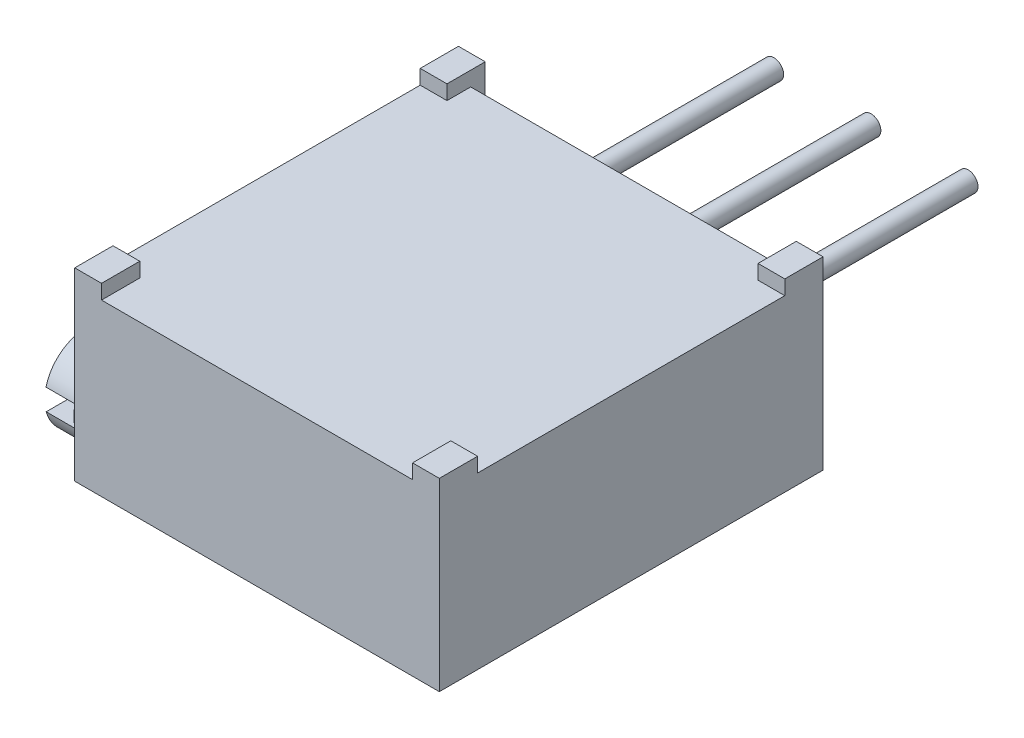
ISO-10303-21;
HEADER;
FILE_DESCRIPTION(('STEP AP214'),'2;1');
FILE_NAME('part.step','',(''),(''),'','','');
FILE_SCHEMA(('AUTOMOTIVE_DESIGN { 1 0 10303 214 1 1 1 1 }'));
ENDSEC;
DATA;
#1=APPLICATION_CONTEXT('core data for automotive mechanical design processes');
#2=APPLICATION_PROTOCOL_DEFINITION('international standard','automotive_design',2000,#1);
#3=PRODUCT_CONTEXT('',#1,'mechanical');
#4=PRODUCT('Part','Part','',(#3));
#5=PRODUCT_RELATED_PRODUCT_CATEGORY('part','',(#4));
#6=PRODUCT_DEFINITION_FORMATION('','',#4);
#7=PRODUCT_DEFINITION_CONTEXT('part definition',#1,'design');
#8=PRODUCT_DEFINITION('design','',#6,#7);
#9=PRODUCT_DEFINITION_SHAPE('','',#8);
#10=(LENGTH_UNIT() NAMED_UNIT(*) SI_UNIT(.MILLI.,.METRE.));
#11=(NAMED_UNIT(*) PLANE_ANGLE_UNIT() SI_UNIT($,.RADIAN.));
#12=(NAMED_UNIT(*) SI_UNIT($,.STERADIAN.) SOLID_ANGLE_UNIT());
#13=UNCERTAINTY_MEASURE_WITH_UNIT(LENGTH_MEASURE(1.E-05),#10,'distance_accuracy_value','');
#14=(GEOMETRIC_REPRESENTATION_CONTEXT(3) GLOBAL_UNCERTAINTY_ASSIGNED_CONTEXT((#13)) GLOBAL_UNIT_ASSIGNED_CONTEXT((#10,
#11,#12)) REPRESENTATION_CONTEXT('',''));
#15=CARTESIAN_POINT('',(0.,0.,0.));
#16=DIRECTION('',(0.,0.,1.));
#17=DIRECTION('',(1.,0.,0.));
#18=AXIS2_PLACEMENT_3D('',#15,#16,#17);
#19=CARTESIAN_POINT('',(-8.26,-1.14,8.765));
#20=DIRECTION('',(-1.,0.,0.));
#21=DIRECTION('',(0.,0.,1.));
#22=AXIS2_PLACEMENT_3D('',#19,#20,#21);
#23=PLANE('',#22);
#24=CARTESIAN_POINT('',(-8.26,-1.14,8.765));
#25=DIRECTION('',(-1.,0.,0.));
#26=DIRECTION('',(0.,0.,1.));
#27=AXIS2_PLACEMENT_3D('',#24,#25,#26);
#28=CIRCLE('',#27,1.095);
#29=CARTESIAN_POINT('',(-8.26,-1.43,7.709099910029));
#30=VERTEX_POINT('',#29);
#31=CARTESIAN_POINT('',(-8.26,-1.43,9.820900089971));
#32=VERTEX_POINT('',#31);
#33=EDGE_CURVE('E455',#30,#32,#28,.T.);
#34=ORIENTED_EDGE('',*,*,#33,.T.);
#35=DIRECTION('',(0.,0.,1.));
#36=VECTOR('',#35,1.);
#37=CARTESIAN_POINT('',(-8.26,-1.43,4.17));
#38=LINE('',#37,#36);
#39=EDGE_CURVE('E11',#30,#32,#38,.T.);
#40=ORIENTED_EDGE('',*,*,#39,.F.);
#41=EDGE_LOOP('',(#34,#40));
#42=FACE_BOUND('',#41,.T.);
#43=ADVANCED_FACE('F17',(#42),#23,.T.);
#44=CARTESIAN_POINT('',(-7.5,-1.43,4.17));
#45=DIRECTION('',(0.,1.,0.));
#46=DIRECTION('',(1.,0.,0.));
#47=AXIS2_PLACEMENT_3D('',#44,#45,#46);
#48=PLANE('',#47);
#49=DIRECTION('',(0.,0.,1.));
#50=VECTOR('',#49,1.);
#51=CARTESIAN_POINT('',(-7.5,-1.43,4.17));
#52=LINE('',#51,#50);
#53=CARTESIAN_POINT('',(-7.5,-1.43,7.709099910029));
#54=VERTEX_POINT('',#53);
#55=CARTESIAN_POINT('',(-7.5,-1.43,9.820900089971));
#56=VERTEX_POINT('',#55);
#57=EDGE_CURVE('E28',#54,#56,#52,.T.);
#58=ORIENTED_EDGE('',*,*,#57,.F.);
#59=DIRECTION('',(-1.,0.,0.));
#60=VECTOR('',#59,1.);
#61=CARTESIAN_POINT('',(-7.24,-1.43,7.709099910029));
#62=LINE('',#61,#60);
#63=EDGE_CURVE('E285',#54,#30,#62,.T.);
#64=ORIENTED_EDGE('',*,*,#63,.T.);
#65=ORIENTED_EDGE('',*,*,#39,.T.);
#66=DIRECTION('',(-1.,0.,0.));
#67=VECTOR('',#66,1.);
#68=CARTESIAN_POINT('',(-7.24,-1.43,9.820900089971));
#69=LINE('',#68,#67);
#70=EDGE_CURVE('E418',#56,#32,#69,.T.);
#71=ORIENTED_EDGE('',*,*,#70,.F.);
#72=EDGE_LOOP('',(#58,#64,#65,#71));
#73=FACE_BOUND('',#72,.T.);
#74=ADVANCED_FACE('F583',(#73),#48,.T.);
#75=CARTESIAN_POINT('',(-7.5,-1.43,4.17));
#76=DIRECTION('',(-1.,0.,0.));
#77=DIRECTION('',(0.,0.,1.));
#78=AXIS2_PLACEMENT_3D('',#75,#76,#77);
#79=PLANE('',#78);
#80=DIRECTION('',(0.,0.,1.));
#81=VECTOR('',#80,1.);
#82=CARTESIAN_POINT('',(-7.5,-0.87,4.17));
#83=LINE('',#82,#81);
#84=CARTESIAN_POINT('',(-7.5,-0.87,7.703809630651));
#85=VERTEX_POINT('',#84);
#86=CARTESIAN_POINT('',(-7.5,-0.87,9.826190369349));
#87=VERTEX_POINT('',#86);
#88=EDGE_CURVE('E42',#85,#87,#83,.T.);
#89=ORIENTED_EDGE('',*,*,#88,.F.);
#90=CARTESIAN_POINT('',(-7.5,-1.14,8.765));
#91=DIRECTION('',(-1.,0.,0.));
#92=DIRECTION('',(0.,0.,1.));
#93=AXIS2_PLACEMENT_3D('',#90,#91,#92);
#94=CIRCLE('',#93,1.095);
#95=EDGE_CURVE('E282',#85,#54,#94,.T.);
#96=ORIENTED_EDGE('',*,*,#95,.T.);
#97=ORIENTED_EDGE('',*,*,#57,.T.);
#98=CARTESIAN_POINT('',(-7.5,-1.14,8.765));
#99=DIRECTION('',(-1.,0.,0.));
#100=DIRECTION('',(0.,0.,1.));
#101=AXIS2_PLACEMENT_3D('',#98,#99,#100);
#102=CIRCLE('',#101,1.095);
#103=CARTESIAN_POINT('',(-7.5,-1.14,9.86));
#104=VERTEX_POINT('',#103);
#105=EDGE_CURVE('E408',#56,#104,#102,.T.);
#106=ORIENTED_EDGE('',*,*,#105,.T.);
#107=CARTESIAN_POINT('',(-7.5,-1.14,8.765));
#108=DIRECTION('',(-1.,0.,0.));
#109=DIRECTION('',(0.,0.,1.));
#110=AXIS2_PLACEMENT_3D('',#107,#108,#109);
#111=CIRCLE('',#110,1.095);
#112=EDGE_CURVE('E390',#104,#87,#111,.T.);
#113=ORIENTED_EDGE('',*,*,#112,.T.);
#114=EDGE_LOOP('',(#89,#96,#97,#106,#113));
#115=FACE_BOUND('',#114,.T.);
#116=ADVANCED_FACE('F578',(#115),#79,.T.);
#117=CARTESIAN_POINT('',(-7.5,-0.87,4.17));
#118=DIRECTION('',(0.,1.,0.));
#119=DIRECTION('',(1.,0.,0.));
#120=AXIS2_PLACEMENT_3D('',#117,#118,#119);
#121=PLANE('',#120);
#122=DIRECTION('',(-1.,0.,0.));
#123=VECTOR('',#122,1.);
#124=CARTESIAN_POINT('',(-7.24,-0.87,9.826190369349));
#125=LINE('',#124,#123);
#126=CARTESIAN_POINT('',(-8.26,-0.87,9.826190369349));
#127=VERTEX_POINT('',#126);
#128=EDGE_CURVE('E394',#87,#127,#125,.T.);
#129=ORIENTED_EDGE('',*,*,#128,.T.);
#130=DIRECTION('',(0.,0.,1.));
#131=VECTOR('',#130,1.);
#132=CARTESIAN_POINT('',(-8.26,-0.87,4.17));
#133=LINE('',#132,#131);
#134=CARTESIAN_POINT('',(-8.26,-0.87,7.703809630651));
#135=VERTEX_POINT('',#134);
#136=EDGE_CURVE('E297',#135,#127,#133,.T.);
#137=ORIENTED_EDGE('',*,*,#136,.F.);
#138=DIRECTION('',(-1.,0.,0.));
#139=VECTOR('',#138,1.);
#140=CARTESIAN_POINT('',(-7.24,-0.87,7.703809630651));
#141=LINE('',#140,#139);
#142=EDGE_CURVE('E284',#85,#135,#141,.T.);
#143=ORIENTED_EDGE('',*,*,#142,.F.);
#144=ORIENTED_EDGE('',*,*,#88,.T.);
#145=EDGE_LOOP('',(#129,#137,#143,#144));
#146=FACE_BOUND('',#145,.T.);
#147=ADVANCED_FACE('F582',(#146),#121,.F.);
#148=CARTESIAN_POINT('',(-8.26,-1.14,8.765));
#149=DIRECTION('',(-1.,0.,0.));
#150=DIRECTION('',(0.,0.,1.));
#151=AXIS2_PLACEMENT_3D('',#148,#149,#150);
#152=PLANE('',#151);
#153=ORIENTED_EDGE('',*,*,#136,.T.);
#154=CARTESIAN_POINT('',(-8.26,-1.14,8.765));
#155=DIRECTION('',(-1.,0.,0.));
#156=DIRECTION('',(0.,0.,1.));
#157=AXIS2_PLACEMENT_3D('',#154,#155,#156);
#158=CIRCLE('',#157,1.095);
#159=EDGE_CURVE('E388',#127,#135,#158,.T.);
#160=ORIENTED_EDGE('',*,*,#159,.T.);
#161=EDGE_LOOP('',(#153,#160));
#162=FACE_BOUND('',#161,.T.);
#163=ADVANCED_FACE('F621',(#162),#152,.T.);
#164=CARTESIAN_POINT('',(-5.08,0.,-6.02));
#165=DIRECTION('',(0.,0.,1.));
#166=DIRECTION('',(1.,0.,0.));
#167=AXIS2_PLACEMENT_3D('',#164,#165,#166);
#168=PLANE('',#167);
#169=CARTESIAN_POINT('',(-5.08,0.,-6.02));
#170=DIRECTION('',(0.,0.,1.));
#171=DIRECTION('',(1.,0.,0.));
#172=AXIS2_PLACEMENT_3D('',#169,#170,#171);
#173=CIRCLE('',#172,0.255);
#174=CARTESIAN_POINT('',(-4.825,0.,-6.02));
#175=VERTEX_POINT('',#174);
#176=EDGE_CURVE('E389',#175,#175,#173,.T.);
#177=ORIENTED_EDGE('',*,*,#176,.F.);
#178=EDGE_LOOP('',(#177));
#179=FACE_BOUND('',#178,.T.);
#180=ADVANCED_FACE('F638',(#179),#168,.F.);
#181=CARTESIAN_POINT('',(-2.54,0.,-6.02));
#182=DIRECTION('',(0.,0.,1.));
#183=DIRECTION('',(1.,0.,0.));
#184=AXIS2_PLACEMENT_3D('',#181,#182,#183);
#185=PLANE('',#184);
#186=CARTESIAN_POINT('',(-2.54,0.,-6.02));
#187=DIRECTION('',(0.,0.,1.));
#188=DIRECTION('',(1.,0.,0.));
#189=AXIS2_PLACEMENT_3D('',#186,#187,#188);
#190=CIRCLE('',#189,0.255);
#191=CARTESIAN_POINT('',(-2.285,0.,-6.02));
#192=VERTEX_POINT('',#191);
#193=EDGE_CURVE('E334',#192,#192,#190,.T.);
#194=ORIENTED_EDGE('',*,*,#193,.F.);
#195=EDGE_LOOP('',(#194));
#196=FACE_BOUND('',#195,.T.);
#197=ADVANCED_FACE('F654',(#196),#185,.F.);
#198=CARTESIAN_POINT('',(0.,0.,-6.02));
#199=DIRECTION('',(0.,0.,1.));
#200=DIRECTION('',(1.,0.,0.));
#201=AXIS2_PLACEMENT_3D('',#198,#199,#200);
#202=PLANE('',#201);
#203=CARTESIAN_POINT('',(0.,0.,-6.02));
#204=DIRECTION('',(0.,0.,1.));
#205=DIRECTION('',(1.,0.,0.));
#206=AXIS2_PLACEMENT_3D('',#203,#204,#205);
#207=CIRCLE('',#206,0.255);
#208=CARTESIAN_POINT('',(0.255,0.,-6.02));
#209=VERTEX_POINT('',#208);
#210=EDGE_CURVE('E335',#209,#209,#207,.T.);
#211=ORIENTED_EDGE('',*,*,#210,.F.);
#212=EDGE_LOOP('',(#211));
#213=FACE_BOUND('',#212,.T.);
#214=ADVANCED_FACE('F569',(#213),#202,.F.);
#215=CARTESIAN_POINT('',(-7.24,-1.14,8.765));
#216=DIRECTION('',(-1.,0.,0.));
#217=DIRECTION('',(0.,0.,1.));
#218=AXIS2_PLACEMENT_3D('',#215,#216,#217);
#219=CYLINDRICAL_SURFACE('',#218,1.095);
#220=ORIENTED_EDGE('',*,*,#159,.F.);
#221=ORIENTED_EDGE('',*,*,#128,.F.);
#222=ORIENTED_EDGE('',*,*,#112,.F.);
#223=DIRECTION('',(-1.,0.,0.));
#224=VECTOR('',#223,1.);
#225=CARTESIAN_POINT('',(-7.24,-1.14,9.86));
#226=LINE('',#225,#224);
#227=CARTESIAN_POINT('',(-7.305,-1.14,9.86));
#228=VERTEX_POINT('',#227);
#229=EDGE_CURVE('E393',#228,#104,#226,.T.);
#230=ORIENTED_EDGE('',*,*,#229,.F.);
#231=CARTESIAN_POINT('',(-7.305,-1.14,8.765));
#232=DIRECTION('',(-1.,0.,0.));
#233=DIRECTION('',(0.,0.,1.));
#234=AXIS2_PLACEMENT_3D('',#231,#232,#233);
#235=CIRCLE('',#234,1.095);
#236=EDGE_CURVE('E316',#228,#228,#235,.T.);
#237=ORIENTED_EDGE('',*,*,#236,.T.);
#238=ORIENTED_EDGE('',*,*,#229,.T.);
#239=ORIENTED_EDGE('',*,*,#105,.F.);
#240=ORIENTED_EDGE('',*,*,#70,.T.);
#241=ORIENTED_EDGE('',*,*,#33,.F.);
#242=ORIENTED_EDGE('',*,*,#63,.F.);
#243=ORIENTED_EDGE('',*,*,#95,.F.);
#244=ORIENTED_EDGE('',*,*,#142,.T.);
#245=EDGE_LOOP('',(#220,#221,#222,#230,#237,#238,#239,#240,#241,#242,#243,#244));
#246=FACE_BOUND('',#245,.T.);
#247=ADVANCED_FACE('F565',(#246),#219,.T.);
#248=CARTESIAN_POINT('',(-7.305,2.41,1.));
#249=DIRECTION('',(0.,-1.,0.));
#250=DIRECTION('',(0.,0.,-1.));
#251=AXIS2_PLACEMENT_3D('',#248,#249,#250);
#252=PLANE('',#251);
#253=DIRECTION('',(0.,0.,-1.));
#254=VECTOR('',#253,1.);
#255=CARTESIAN_POINT('',(-6.605,2.41,1.));
#256=LINE('',#255,#254);
#257=CARTESIAN_POINT('',(-6.605,2.41,1.));
#258=VERTEX_POINT('',#257);
#259=CARTESIAN_POINT('',(-6.605,2.41,0.));
#260=VERTEX_POINT('',#259);
#261=EDGE_CURVE('E404',#258,#260,#256,.T.);
#262=ORIENTED_EDGE('',*,*,#261,.T.);
#263=DIRECTION('',(1.,0.,0.));
#264=VECTOR('',#263,1.);
#265=CARTESIAN_POINT('',(-7.305,2.41,0.));
#266=LINE('',#265,#264);
#267=CARTESIAN_POINT('',(-7.305,2.41,0.));
#268=VERTEX_POINT('',#267);
#269=EDGE_CURVE('E384',#268,#260,#266,.T.);
#270=ORIENTED_EDGE('',*,*,#269,.F.);
#271=DIRECTION('',(0.,0.,-1.));
#272=VECTOR('',#271,1.);
#273=CARTESIAN_POINT('',(-7.305,2.41,1.));
#274=LINE('',#273,#272);
#275=CARTESIAN_POINT('',(-7.305,2.41,1.));
#276=VERTEX_POINT('',#275);
#277=EDGE_CURVE('E286',#276,#268,#274,.T.);
#278=ORIENTED_EDGE('',*,*,#277,.F.);
#279=DIRECTION('',(1.,0.,0.));
#280=VECTOR('',#279,1.);
#281=CARTESIAN_POINT('',(-7.305,2.41,1.));
#282=LINE('',#281,#280);
#283=EDGE_CURVE('E433',#276,#258,#282,.T.);
#284=ORIENTED_EDGE('',*,*,#283,.T.);
#285=EDGE_LOOP('',(#262,#270,#278,#284));
#286=FACE_BOUND('',#285,.T.);
#287=ADVANCED_FACE('F510',(#286),#252,.F.);
#288=CARTESIAN_POINT('',(-7.305,2.41,0.));
#289=DIRECTION('',(0.,0.,-1.));
#290=DIRECTION('',(0.,-1.,0.));
#291=AXIS2_PLACEMENT_3D('',#288,#289,#290);
#292=PLANE('',#291);
#293=DIRECTION('',(0.,-1.,0.));
#294=VECTOR('',#293,1.);
#295=CARTESIAN_POINT('',(-7.305,2.41,0.));
#296=LINE('',#295,#294);
#297=CARTESIAN_POINT('',(-7.305,-2.42,0.));
#298=VERTEX_POINT('',#297);
#299=EDGE_CURVE('E290',#268,#298,#296,.T.);
#300=ORIENTED_EDGE('',*,*,#299,.F.);
#301=ORIENTED_EDGE('',*,*,#269,.T.);
#302=DIRECTION('',(0.,-1.,0.));
#303=VECTOR('',#302,1.);
#304=CARTESIAN_POINT('',(-6.605,2.41,0.));
#305=LINE('',#304,#303);
#306=CARTESIAN_POINT('',(-6.605,-2.42,0.));
#307=VERTEX_POINT('',#306);
#308=EDGE_CURVE('E400',#260,#307,#305,.T.);
#309=ORIENTED_EDGE('',*,*,#308,.T.);
#310=DIRECTION('',(1.,0.,0.));
#311=VECTOR('',#310,1.);
#312=CARTESIAN_POINT('',(-7.305,-2.42,0.));
#313=LINE('',#312,#311);
#314=EDGE_CURVE('E292',#298,#307,#313,.T.);
#315=ORIENTED_EDGE('',*,*,#314,.F.);
#316=EDGE_LOOP('',(#300,#301,#309,#315));
#317=FACE_BOUND('',#316,.T.);
#318=ADVANCED_FACE('F518',(#317),#292,.T.);
#319=CARTESIAN_POINT('',(-5.08,0.,-6.02));
#320=DIRECTION('',(0.,0.,1.));
#321=DIRECTION('',(1.,0.,0.));
#322=AXIS2_PLACEMENT_3D('',#319,#320,#321);
#323=CYLINDRICAL_SURFACE('',#322,0.255);
#324=CARTESIAN_POINT('',(-5.08,0.,0.38));
#325=DIRECTION('',(0.,0.,1.));
#326=DIRECTION('',(1.,0.,0.));
#327=AXIS2_PLACEMENT_3D('',#324,#325,#326);
#328=CIRCLE('',#327,0.255);
#329=CARTESIAN_POINT('',(-4.825,0.,0.38));
#330=VERTEX_POINT('',#329);
#331=EDGE_CURVE('E405',#330,#330,#328,.T.);
#332=ORIENTED_EDGE('',*,*,#331,.F.);
#333=DIRECTION('',(0.,0.,1.));
#334=VECTOR('',#333,1.);
#335=CARTESIAN_POINT('',(-4.825,0.,-6.02));
#336=LINE('',#335,#334);
#337=EDGE_CURVE('E346',#175,#330,#336,.T.);
#338=ORIENTED_EDGE('',*,*,#337,.F.);
#339=ORIENTED_EDGE('',*,*,#176,.T.);
#340=ORIENTED_EDGE('',*,*,#337,.T.);
#341=EDGE_LOOP('',(#332,#338,#339,#340));
#342=FACE_BOUND('',#341,.T.);
#343=ADVANCED_FACE('F604',(#342),#323,.T.);
#344=CARTESIAN_POINT('',(-2.54,0.,-6.02));
#345=DIRECTION('',(0.,0.,1.));
#346=DIRECTION('',(1.,0.,0.));
#347=AXIS2_PLACEMENT_3D('',#344,#345,#346);
#348=CYLINDRICAL_SURFACE('',#347,0.255);
#349=CARTESIAN_POINT('',(-2.54,0.,0.38));
#350=DIRECTION('',(0.,0.,1.));
#351=DIRECTION('',(1.,0.,0.));
#352=AXIS2_PLACEMENT_3D('',#349,#350,#351);
#353=CIRCLE('',#352,0.255);
#354=CARTESIAN_POINT('',(-2.285,0.,0.38));
#355=VERTEX_POINT('',#354);
#356=EDGE_CURVE('E436',#355,#355,#353,.T.);
#357=ORIENTED_EDGE('',*,*,#356,.F.);
#358=DIRECTION('',(0.,0.,1.));
#359=VECTOR('',#358,1.);
#360=CARTESIAN_POINT('',(-2.285,0.,-6.02));
#361=LINE('',#360,#359);
#362=EDGE_CURVE('E331',#192,#355,#361,.T.);
#363=ORIENTED_EDGE('',*,*,#362,.F.);
#364=ORIENTED_EDGE('',*,*,#193,.T.);
#365=ORIENTED_EDGE('',*,*,#362,.T.);
#366=EDGE_LOOP('',(#357,#363,#364,#365));
#367=FACE_BOUND('',#366,.T.);
#368=ADVANCED_FACE('F594',(#367),#348,.T.);
#369=CARTESIAN_POINT('',(0.,0.,-6.02));
#370=DIRECTION('',(0.,0.,1.));
#371=DIRECTION('',(1.,0.,0.));
#372=AXIS2_PLACEMENT_3D('',#369,#370,#371);
#373=CYLINDRICAL_SURFACE('',#372,0.255);
#374=CARTESIAN_POINT('',(0.,0.,0.38));
#375=DIRECTION('',(0.,0.,1.));
#376=DIRECTION('',(1.,0.,0.));
#377=AXIS2_PLACEMENT_3D('',#374,#375,#376);
#378=CIRCLE('',#377,0.255);
#379=CARTESIAN_POINT('',(0.255,0.,0.38));
#380=VERTEX_POINT('',#379);
#381=EDGE_CURVE('E363',#380,#380,#378,.T.);
#382=ORIENTED_EDGE('',*,*,#381,.F.);
#383=DIRECTION('',(0.,0.,1.));
#384=VECTOR('',#383,1.);
#385=CARTESIAN_POINT('',(0.255,0.,-6.02));
#386=LINE('',#385,#384);
#387=EDGE_CURVE('E422',#209,#380,#386,.T.);
#388=ORIENTED_EDGE('',*,*,#387,.F.);
#389=ORIENTED_EDGE('',*,*,#210,.T.);
#390=ORIENTED_EDGE('',*,*,#387,.T.);
#391=EDGE_LOOP('',(#382,#388,#389,#390));
#392=FACE_BOUND('',#391,.T.);
#393=ADVANCED_FACE('F590',(#392),#373,.T.);
#394=CARTESIAN_POINT('',(1.525,2.41,1.));
#395=DIRECTION('',(0.,-1.,0.));
#396=DIRECTION('',(0.,0.,-1.));
#397=AXIS2_PLACEMENT_3D('',#394,#395,#396);
#398=PLANE('',#397);
#399=DIRECTION('',(0.,0.,-1.));
#400=VECTOR('',#399,1.);
#401=CARTESIAN_POINT('',(2.225,2.41,1.));
#402=LINE('',#401,#400);
#403=CARTESIAN_POINT('',(2.225,2.41,1.));
#404=VERTEX_POINT('',#403);
#405=CARTESIAN_POINT('',(2.225,2.41,0.));
#406=VERTEX_POINT('',#405);
#407=EDGE_CURVE('E249',#404,#406,#402,.T.);
#408=ORIENTED_EDGE('',*,*,#407,.T.);
#409=DIRECTION('',(1.,0.,0.));
#410=VECTOR('',#409,1.);
#411=CARTESIAN_POINT('',(1.525,2.41,0.));
#412=LINE('',#411,#410);
#413=CARTESIAN_POINT('',(1.525,2.41,0.));
#414=VERTEX_POINT('',#413);
#415=EDGE_CURVE('E419',#414,#406,#412,.T.);
#416=ORIENTED_EDGE('',*,*,#415,.F.);
#417=DIRECTION('',(0.,0.,-1.));
#418=VECTOR('',#417,1.);
#419=CARTESIAN_POINT('',(1.525,2.41,1.));
#420=LINE('',#419,#418);
#421=CARTESIAN_POINT('',(1.525,2.41,1.));
#422=VERTEX_POINT('',#421);
#423=EDGE_CURVE('E252',#422,#414,#420,.T.);
#424=ORIENTED_EDGE('',*,*,#423,.F.);
#425=DIRECTION('',(1.,0.,0.));
#426=VECTOR('',#425,1.);
#427=CARTESIAN_POINT('',(1.525,2.41,1.));
#428=LINE('',#427,#426);
#429=EDGE_CURVE('E21',#422,#404,#428,.T.);
#430=ORIENTED_EDGE('',*,*,#429,.T.);
#431=EDGE_LOOP('',(#408,#416,#424,#430));
#432=FACE_BOUND('',#431,.T.);
#433=ADVANCED_FACE('F247',(#432),#398,.F.);
#434=CARTESIAN_POINT('',(1.525,2.41,0.));
#435=DIRECTION('',(0.,0.,-1.));
#436=DIRECTION('',(0.,-1.,0.));
#437=AXIS2_PLACEMENT_3D('',#434,#435,#436);
#438=PLANE('',#437);
#439=DIRECTION('',(0.,-1.,0.));
#440=VECTOR('',#439,1.);
#441=CARTESIAN_POINT('',(1.525,2.41,0.));
#442=LINE('',#441,#440);
#443=CARTESIAN_POINT('',(1.525,-2.42,0.));
#444=VERTEX_POINT('',#443);
#445=EDGE_CURVE('E365',#414,#444,#442,.T.);
#446=ORIENTED_EDGE('',*,*,#445,.F.);
#447=ORIENTED_EDGE('',*,*,#415,.T.);
#448=DIRECTION('',(0.,-1.,0.));
#449=VECTOR('',#448,1.);
#450=CARTESIAN_POINT('',(2.225,2.41,0.));
#451=LINE('',#450,#449);
#452=CARTESIAN_POINT('',(2.225,-2.42,0.));
#453=VERTEX_POINT('',#452);
#454=EDGE_CURVE('E269',#406,#453,#451,.T.);
#455=ORIENTED_EDGE('',*,*,#454,.T.);
#456=DIRECTION('',(1.,0.,0.));
#457=VECTOR('',#456,1.);
#458=CARTESIAN_POINT('',(1.525,-2.42,0.));
#459=LINE('',#458,#457);
#460=EDGE_CURVE('E295',#444,#453,#459,.T.);
#461=ORIENTED_EDGE('',*,*,#460,.F.);
#462=EDGE_LOOP('',(#446,#447,#455,#461));
#463=FACE_BOUND('',#462,.T.);
#464=ADVANCED_FACE('F722',(#463),#438,.T.);
#465=CARTESIAN_POINT('',(-7.305,2.41,10.03));
#466=DIRECTION('',(0.,-1.,0.));
#467=DIRECTION('',(0.,0.,-1.));
#468=AXIS2_PLACEMENT_3D('',#465,#466,#467);
#469=PLANE('',#468);
#470=DIRECTION('',(0.,0.,-1.));
#471=VECTOR('',#470,1.);
#472=CARTESIAN_POINT('',(-6.605,2.41,10.03));
#473=LINE('',#472,#471);
#474=CARTESIAN_POINT('',(-6.605,2.41,10.03));
#475=VERTEX_POINT('',#474);
#476=CARTESIAN_POINT('',(-6.605,2.41,9.03));
#477=VERTEX_POINT('',#476);
#478=EDGE_CURVE('E296',#475,#477,#473,.T.);
#479=ORIENTED_EDGE('',*,*,#478,.T.);
#480=DIRECTION('',(1.,0.,0.));
#481=VECTOR('',#480,1.);
#482=CARTESIAN_POINT('',(-7.305,2.41,9.03));
#483=LINE('',#482,#481);
#484=CARTESIAN_POINT('',(-7.305,2.41,9.03));
#485=VERTEX_POINT('',#484);
#486=EDGE_CURVE('E325',#485,#477,#483,.T.);
#487=ORIENTED_EDGE('',*,*,#486,.F.);
#488=DIRECTION('',(0.,0.,-1.));
#489=VECTOR('',#488,1.);
#490=CARTESIAN_POINT('',(-7.305,2.41,10.03));
#491=LINE('',#490,#489);
#492=CARTESIAN_POINT('',(-7.305,2.41,10.03));
#493=VERTEX_POINT('',#492);
#494=EDGE_CURVE('E350',#493,#485,#491,.T.);
#495=ORIENTED_EDGE('',*,*,#494,.F.);
#496=DIRECTION('',(1.,0.,0.));
#497=VECTOR('',#496,1.);
#498=CARTESIAN_POINT('',(-7.305,2.41,10.03));
#499=LINE('',#498,#497);
#500=EDGE_CURVE('E484',#493,#475,#499,.T.);
#501=ORIENTED_EDGE('',*,*,#500,.T.);
#502=EDGE_LOOP('',(#479,#487,#495,#501));
#503=FACE_BOUND('',#502,.T.);
#504=ADVANCED_FACE('F733',(#503),#469,.F.);
#505=CARTESIAN_POINT('',(1.525,2.41,10.03));
#506=DIRECTION('',(0.,-1.,0.));
#507=DIRECTION('',(0.,0.,-1.));
#508=AXIS2_PLACEMENT_3D('',#505,#506,#507);
#509=PLANE('',#508);
#510=DIRECTION('',(0.,0.,-1.));
#511=VECTOR('',#510,1.);
#512=CARTESIAN_POINT('',(2.225,2.41,10.03));
#513=LINE('',#512,#511);
#514=CARTESIAN_POINT('',(2.225,2.41,10.03));
#515=VERTEX_POINT('',#514);
#516=CARTESIAN_POINT('',(2.225,2.41,9.03));
#517=VERTEX_POINT('',#516);
#518=EDGE_CURVE('E349',#515,#517,#513,.T.);
#519=ORIENTED_EDGE('',*,*,#518,.T.);
#520=DIRECTION('',(1.,0.,0.));
#521=VECTOR('',#520,1.);
#522=CARTESIAN_POINT('',(1.525,2.41,9.03));
#523=LINE('',#522,#521);
#524=CARTESIAN_POINT('',(1.525,2.41,9.03));
#525=VERTEX_POINT('',#524);
#526=EDGE_CURVE('E395',#525,#517,#523,.T.);
#527=ORIENTED_EDGE('',*,*,#526,.F.);
#528=DIRECTION('',(0.,0.,-1.));
#529=VECTOR('',#528,1.);
#530=CARTESIAN_POINT('',(1.525,2.41,10.03));
#531=LINE('',#530,#529);
#532=CARTESIAN_POINT('',(1.525,2.41,10.03));
#533=VERTEX_POINT('',#532);
#534=EDGE_CURVE('E355',#533,#525,#531,.T.);
#535=ORIENTED_EDGE('',*,*,#534,.F.);
#536=DIRECTION('',(1.,0.,0.));
#537=VECTOR('',#536,1.);
#538=CARTESIAN_POINT('',(1.525,2.41,10.03));
#539=LINE('',#538,#537);
#540=EDGE_CURVE('E336',#533,#515,#539,.T.);
#541=ORIENTED_EDGE('',*,*,#540,.T.);
#542=EDGE_LOOP('',(#519,#527,#535,#541));
#543=FACE_BOUND('',#542,.T.);
#544=ADVANCED_FACE('F745',(#543),#509,.F.);
#545=CARTESIAN_POINT('',(-2.54,-2.42,5.000516549649));
#546=DIRECTION('',(0.,-1.,0.));
#547=DIRECTION('',(0.,0.,-1.));
#548=AXIS2_PLACEMENT_3D('',#545,#546,#547);
#549=PLANE('',#548);
#550=DIRECTION('',(1.,0.,0.));
#551=VECTOR('',#550,1.);
#552=CARTESIAN_POINT('',(-7.305,-2.42,10.03));
#553=LINE('',#552,#551);
#554=CARTESIAN_POINT('',(-7.305,-2.42,10.03));
#555=VERTEX_POINT('',#554);
#556=CARTESIAN_POINT('',(2.225,-2.42,10.03));
#557=VERTEX_POINT('',#556);
#558=EDGE_CURVE('E383',#555,#557,#553,.T.);
#559=ORIENTED_EDGE('',*,*,#558,.F.);
#560=DIRECTION('',(0.,0.,-1.));
#561=VECTOR('',#560,1.);
#562=CARTESIAN_POINT('',(-7.305,-2.42,1.));
#563=LINE('',#562,#561);
#564=EDGE_CURVE('E310',#555,#298,#563,.T.);
#565=ORIENTED_EDGE('',*,*,#564,.T.);
#566=ORIENTED_EDGE('',*,*,#314,.T.);
#567=DIRECTION('',(0.,0.,-1.));
#568=VECTOR('',#567,1.);
#569=CARTESIAN_POINT('',(-6.605,-2.42,1.));
#570=LINE('',#569,#568);
#571=CARTESIAN_POINT('',(-6.605,-2.42,0.38));
#572=VERTEX_POINT('',#571);
#573=EDGE_CURVE('E280',#572,#307,#570,.T.);
#574=ORIENTED_EDGE('',*,*,#573,.F.);
#575=DIRECTION('',(1.,0.,0.));
#576=VECTOR('',#575,1.);
#577=CARTESIAN_POINT('',(-7.305,-2.42,0.38));
#578=LINE('',#577,#576);
#579=CARTESIAN_POINT('',(1.525,-2.42,0.38));
#580=VERTEX_POINT('',#579);
#581=EDGE_CURVE('E364',#572,#580,#578,.T.);
#582=ORIENTED_EDGE('',*,*,#581,.T.);
#583=DIRECTION('',(0.,0.,-1.));
#584=VECTOR('',#583,1.);
#585=CARTESIAN_POINT('',(1.525,-2.42,1.));
#586=LINE('',#585,#584);
#587=EDGE_CURVE('E462',#580,#444,#586,.T.);
#588=ORIENTED_EDGE('',*,*,#587,.T.);
#589=ORIENTED_EDGE('',*,*,#460,.T.);
#590=DIRECTION('',(0.,0.,-1.));
#591=VECTOR('',#590,1.);
#592=CARTESIAN_POINT('',(2.225,-2.42,1.));
#593=LINE('',#592,#591);
#594=EDGE_CURVE('E276',#557,#453,#593,.T.);
#595=ORIENTED_EDGE('',*,*,#594,.F.);
#596=EDGE_LOOP('',(#559,#565,#566,#574,#582,#588,#589,#595));
#597=FACE_BOUND('',#596,.T.);
#598=ADVANCED_FACE('F756',(#597),#549,.T.);
#599=CARTESIAN_POINT('',(-6.605,2.41,10.03));
#600=DIRECTION('',(1.,0.,0.));
#601=DIRECTION('',(0.,1.,0.));
#602=AXIS2_PLACEMENT_3D('',#599,#600,#601);
#603=PLANE('',#602);
#604=DIRECTION('',(0.,-1.,0.));
#605=VECTOR('',#604,1.);
#606=CARTESIAN_POINT('',(-6.605,2.41,9.03));
#607=LINE('',#606,#605);
#608=CARTESIAN_POINT('',(-6.605,2.03,9.03));
#609=VERTEX_POINT('',#608);
#610=EDGE_CURVE('E426',#477,#609,#607,.T.);
#611=ORIENTED_EDGE('',*,*,#610,.F.);
#612=ORIENTED_EDGE('',*,*,#478,.F.);
#613=DIRECTION('',(0.,-1.,0.));
#614=VECTOR('',#613,1.);
#615=CARTESIAN_POINT('',(-6.605,2.41,10.03));
#616=LINE('',#615,#614);
#617=CARTESIAN_POINT('',(-6.605,2.03,10.03));
#618=VERTEX_POINT('',#617);
#619=EDGE_CURVE('E483',#475,#618,#616,.T.);
#620=ORIENTED_EDGE('',*,*,#619,.T.);
#621=DIRECTION('',(0.,0.,1.));
#622=VECTOR('',#621,1.);
#623=CARTESIAN_POINT('',(-6.605,2.03,10.03));
#624=LINE('',#623,#622);
#625=EDGE_CURVE('E427',#609,#618,#624,.T.);
#626=ORIENTED_EDGE('',*,*,#625,.F.);
#627=EDGE_LOOP('',(#611,#612,#620,#626));
#628=FACE_BOUND('',#627,.T.);
#629=ADVANCED_FACE('F768',(#628),#603,.T.);
#630=CARTESIAN_POINT('',(-7.305,2.41,9.03));
#631=DIRECTION('',(0.,0.,-1.));
#632=DIRECTION('',(0.,-1.,0.));
#633=AXIS2_PLACEMENT_3D('',#630,#631,#632);
#634=PLANE('',#633);
#635=DIRECTION('',(0.,-1.,0.));
#636=VECTOR('',#635,1.);
#637=CARTESIAN_POINT('',(-7.305,2.41,9.03));
#638=LINE('',#637,#636);
#639=CARTESIAN_POINT('',(-7.305,2.03,9.03));
#640=VERTEX_POINT('',#639);
#641=EDGE_CURVE('E291',#485,#640,#638,.T.);
#642=ORIENTED_EDGE('',*,*,#641,.F.);
#643=ORIENTED_EDGE('',*,*,#486,.T.);
#644=ORIENTED_EDGE('',*,*,#610,.T.);
#645=DIRECTION('',(1.,0.,0.));
#646=VECTOR('',#645,1.);
#647=CARTESIAN_POINT('',(-7.305,2.03,9.03));
#648=LINE('',#647,#646);
#649=EDGE_CURVE('E432',#640,#609,#648,.T.);
#650=ORIENTED_EDGE('',*,*,#649,.F.);
#651=EDGE_LOOP('',(#642,#643,#644,#650));
#652=FACE_BOUND('',#651,.T.);
#653=ADVANCED_FACE('F777',(#652),#634,.T.);
#654=CARTESIAN_POINT('',(-7.305,-0.04963254593176,5.015));
#655=DIRECTION('',(-1.,0.,0.));
#656=DIRECTION('',(0.,0.,1.));
#657=AXIS2_PLACEMENT_3D('',#654,#655,#656);
#658=PLANE('',#657);
#659=ORIENTED_EDGE('',*,*,#236,.F.);
#660=EDGE_LOOP('',(#659));
#661=FACE_BOUND('',#660,.T.);
#662=DIRECTION('',(0.,-1.,0.));
#663=VECTOR('',#662,1.);
#664=CARTESIAN_POINT('',(-7.305,2.41,10.03));
#665=LINE('',#664,#663);
#666=EDGE_CURVE('E360',#493,#555,#665,.T.);
#667=ORIENTED_EDGE('',*,*,#666,.F.);
#668=ORIENTED_EDGE('',*,*,#494,.T.);
#669=ORIENTED_EDGE('',*,*,#641,.T.);
#670=DIRECTION('',(0.,0.,-1.));
#671=VECTOR('',#670,1.);
#672=CARTESIAN_POINT('',(-7.305,2.03,10.03));
#673=LINE('',#672,#671);
#674=CARTESIAN_POINT('',(-7.305,2.03,1.));
#675=VERTEX_POINT('',#674);
#676=EDGE_CURVE('E376',#640,#675,#673,.T.);
#677=ORIENTED_EDGE('',*,*,#676,.T.);
#678=DIRECTION('',(0.,-1.,0.));
#679=VECTOR('',#678,1.);
#680=CARTESIAN_POINT('',(-7.305,2.41,1.));
#681=LINE('',#680,#679);
#682=EDGE_CURVE('E354',#276,#675,#681,.T.);
#683=ORIENTED_EDGE('',*,*,#682,.F.);
#684=ORIENTED_EDGE('',*,*,#277,.T.);
#685=ORIENTED_EDGE('',*,*,#299,.T.);
#686=ORIENTED_EDGE('',*,*,#564,.F.);
#687=EDGE_LOOP('',(#667,#668,#669,#677,#683,#684,#685,#686));
#688=FACE_BOUND('',#687,.T.);
#689=ADVANCED_FACE('F521',(#661,#688),#658,.T.);
#690=CARTESIAN_POINT('',(-7.305,2.41,1.));
#691=DIRECTION('',(0.,0.,-1.));
#692=DIRECTION('',(0.,-1.,0.));
#693=AXIS2_PLACEMENT_3D('',#690,#691,#692);
#694=PLANE('',#693);
#695=DIRECTION('',(1.,0.,0.));
#696=VECTOR('',#695,1.);
#697=CARTESIAN_POINT('',(-7.305,2.03,1.));
#698=LINE('',#697,#696);
#699=CARTESIAN_POINT('',(-6.605,2.03,1.));
#700=VERTEX_POINT('',#699);
#701=EDGE_CURVE('E307',#675,#700,#698,.T.);
#702=ORIENTED_EDGE('',*,*,#701,.T.);
#703=DIRECTION('',(0.,-1.,0.));
#704=VECTOR('',#703,1.);
#705=CARTESIAN_POINT('',(-6.605,2.41,1.));
#706=LINE('',#705,#704);
#707=EDGE_CURVE('E413',#258,#700,#706,.T.);
#708=ORIENTED_EDGE('',*,*,#707,.F.);
#709=ORIENTED_EDGE('',*,*,#283,.F.);
#710=ORIENTED_EDGE('',*,*,#682,.T.);
#711=EDGE_LOOP('',(#702,#708,#709,#710));
#712=FACE_BOUND('',#711,.T.);
#713=ADVANCED_FACE('F797',(#712),#694,.F.);
#714=CARTESIAN_POINT('',(-6.605,2.41,1.));
#715=DIRECTION('',(1.,0.,0.));
#716=DIRECTION('',(0.,1.,0.));
#717=AXIS2_PLACEMENT_3D('',#714,#715,#716);
#718=PLANE('',#717);
#719=ORIENTED_EDGE('',*,*,#308,.F.);
#720=ORIENTED_EDGE('',*,*,#261,.F.);
#721=ORIENTED_EDGE('',*,*,#707,.T.);
#722=DIRECTION('',(0.,0.,1.));
#723=VECTOR('',#722,1.);
#724=CARTESIAN_POINT('',(-6.605,2.03,5.515));
#725=LINE('',#724,#723);
#726=CARTESIAN_POINT('',(-6.605,2.03,0.38));
#727=VERTEX_POINT('',#726);
#728=EDGE_CURVE('E303',#727,#700,#725,.T.);
#729=ORIENTED_EDGE('',*,*,#728,.F.);
#730=DIRECTION('',(0.,-1.,0.));
#731=VECTOR('',#730,1.);
#732=CARTESIAN_POINT('',(-6.605,2.22,0.38));
#733=LINE('',#732,#731);
#734=EDGE_CURVE('E218',#727,#572,#733,.T.);
#735=ORIENTED_EDGE('',*,*,#734,.T.);
#736=ORIENTED_EDGE('',*,*,#573,.T.);
#737=EDGE_LOOP('',(#719,#720,#721,#729,#735,#736));
#738=FACE_BOUND('',#737,.T.);
#739=ADVANCED_FACE('F516',(#738),#718,.T.);
#740=CARTESIAN_POINT('',(-7.305,2.03,0.38));
#741=DIRECTION('',(0.,0.,-1.));
#742=DIRECTION('',(0.,-1.,0.));
#743=AXIS2_PLACEMENT_3D('',#740,#741,#742);
#744=PLANE('',#743);
#745=ORIENTED_EDGE('',*,*,#331,.T.);
#746=EDGE_LOOP('',(#745));
#747=FACE_BOUND('',#746,.T.);
#748=ORIENTED_EDGE('',*,*,#356,.T.);
#749=EDGE_LOOP('',(#748));
#750=FACE_BOUND('',#749,.T.);
#751=ORIENTED_EDGE('',*,*,#381,.T.);
#752=EDGE_LOOP('',(#751));
#753=FACE_BOUND('',#752,.T.);
#754=ORIENTED_EDGE('',*,*,#581,.F.);
#755=ORIENTED_EDGE('',*,*,#734,.F.);
#756=DIRECTION('',(1.,0.,0.));
#757=VECTOR('',#756,1.);
#758=CARTESIAN_POINT('',(-7.305,2.03,0.38));
#759=LINE('',#758,#757);
#760=CARTESIAN_POINT('',(1.525,2.03,0.38));
#761=VERTEX_POINT('',#760);
#762=EDGE_CURVE('E300',#727,#761,#759,.T.);
#763=ORIENTED_EDGE('',*,*,#762,.T.);
#764=DIRECTION('',(0.,-1.,0.));
#765=VECTOR('',#764,1.);
#766=CARTESIAN_POINT('',(1.525,2.22,0.38));
#767=LINE('',#766,#765);
#768=EDGE_CURVE('E230',#761,#580,#767,.T.);
#769=ORIENTED_EDGE('',*,*,#768,.T.);
#770=EDGE_LOOP('',(#754,#755,#763,#769));
#771=FACE_BOUND('',#770,.T.);
#772=ADVANCED_FACE('F818',(#747,#750,#753,#771),#744,.T.);
#773=CARTESIAN_POINT('',(1.525,2.41,1.));
#774=DIRECTION('',(1.,0.,0.));
#775=DIRECTION('',(0.,1.,0.));
#776=AXIS2_PLACEMENT_3D('',#773,#774,#775);
#777=PLANE('',#776);
#778=ORIENTED_EDGE('',*,*,#587,.F.);
#779=ORIENTED_EDGE('',*,*,#768,.F.);
#780=DIRECTION('',(0.,0.,1.));
#781=VECTOR('',#780,1.);
#782=CARTESIAN_POINT('',(1.525,2.03,5.515));
#783=LINE('',#782,#781);
#784=CARTESIAN_POINT('',(1.525,2.03,1.));
#785=VERTEX_POINT('',#784);
#786=EDGE_CURVE('E304',#761,#785,#783,.T.);
#787=ORIENTED_EDGE('',*,*,#786,.T.);
#788=DIRECTION('',(0.,-1.,0.));
#789=VECTOR('',#788,1.);
#790=CARTESIAN_POINT('',(1.525,2.41,1.));
#791=LINE('',#790,#789);
#792=EDGE_CURVE('E256',#422,#785,#791,.T.);
#793=ORIENTED_EDGE('',*,*,#792,.F.);
#794=ORIENTED_EDGE('',*,*,#423,.T.);
#795=ORIENTED_EDGE('',*,*,#445,.T.);
#796=EDGE_LOOP('',(#778,#779,#787,#793,#794,#795));
#797=FACE_BOUND('',#796,.T.);
#798=ADVANCED_FACE('F827',(#797),#777,.F.);
#799=CARTESIAN_POINT('',(1.525,2.41,1.));
#800=DIRECTION('',(0.,0.,-1.));
#801=DIRECTION('',(0.,-1.,0.));
#802=AXIS2_PLACEMENT_3D('',#799,#800,#801);
#803=PLANE('',#802);
#804=DIRECTION('',(1.,0.,0.));
#805=VECTOR('',#804,1.);
#806=CARTESIAN_POINT('',(-2.89,2.03,1.));
#807=LINE('',#806,#805);
#808=CARTESIAN_POINT('',(2.225,2.03,1.));
#809=VERTEX_POINT('',#808);
#810=EDGE_CURVE('E261',#785,#809,#807,.T.);
#811=ORIENTED_EDGE('',*,*,#810,.T.);
#812=DIRECTION('',(0.,-1.,0.));
#813=VECTOR('',#812,1.);
#814=CARTESIAN_POINT('',(2.225,2.41,1.));
#815=LINE('',#814,#813);
#816=EDGE_CURVE('E257',#404,#809,#815,.T.);
#817=ORIENTED_EDGE('',*,*,#816,.F.);
#818=ORIENTED_EDGE('',*,*,#429,.F.);
#819=ORIENTED_EDGE('',*,*,#792,.T.);
#820=EDGE_LOOP('',(#811,#817,#818,#819));
#821=FACE_BOUND('',#820,.T.);
#822=ADVANCED_FACE('F259',(#821),#803,.F.);
#823=CARTESIAN_POINT('',(2.225,-0.04963254593176,5.015));
#824=DIRECTION('',(1.,0.,0.));
#825=DIRECTION('',(0.,1.,0.));
#826=AXIS2_PLACEMENT_3D('',#823,#824,#825);
#827=PLANE('',#826);
#828=DIRECTION('',(0.,0.,-1.));
#829=VECTOR('',#828,1.);
#830=CARTESIAN_POINT('',(2.225,2.03,10.03));
#831=LINE('',#830,#829);
#832=CARTESIAN_POINT('',(2.225,2.03,9.03));
#833=VERTEX_POINT('',#832);
#834=EDGE_CURVE('E373',#833,#809,#831,.T.);
#835=ORIENTED_EDGE('',*,*,#834,.F.);
#836=DIRECTION('',(0.,-1.,0.));
#837=VECTOR('',#836,1.);
#838=CARTESIAN_POINT('',(2.225,2.41,9.03));
#839=LINE('',#838,#837);
#840=EDGE_CURVE('E399',#517,#833,#839,.T.);
#841=ORIENTED_EDGE('',*,*,#840,.F.);
#842=ORIENTED_EDGE('',*,*,#518,.F.);
#843=DIRECTION('',(0.,-1.,0.));
#844=VECTOR('',#843,1.);
#845=CARTESIAN_POINT('',(2.225,2.03,10.03));
#846=LINE('',#845,#844);
#847=EDGE_CURVE('E341',#515,#557,#846,.T.);
#848=ORIENTED_EDGE('',*,*,#847,.T.);
#849=ORIENTED_EDGE('',*,*,#594,.T.);
#850=ORIENTED_EDGE('',*,*,#454,.F.);
#851=ORIENTED_EDGE('',*,*,#407,.F.);
#852=ORIENTED_EDGE('',*,*,#816,.T.);
#853=EDGE_LOOP('',(#835,#841,#842,#848,#849,#850,#851,#852));
#854=FACE_BOUND('',#853,.T.);
#855=ADVANCED_FACE('F19',(#854),#827,.T.);
#856=CARTESIAN_POINT('',(1.525,2.41,9.03));
#857=DIRECTION('',(0.,0.,-1.));
#858=DIRECTION('',(0.,-1.,0.));
#859=AXIS2_PLACEMENT_3D('',#856,#857,#858);
#860=PLANE('',#859);
#861=DIRECTION('',(0.,-1.,0.));
#862=VECTOR('',#861,1.);
#863=CARTESIAN_POINT('',(1.525,2.41,9.03));
#864=LINE('',#863,#862);
#865=CARTESIAN_POINT('',(1.525,2.03,9.03));
#866=VERTEX_POINT('',#865);
#867=EDGE_CURVE('E359',#525,#866,#864,.T.);
#868=ORIENTED_EDGE('',*,*,#867,.F.);
#869=ORIENTED_EDGE('',*,*,#526,.T.);
#870=ORIENTED_EDGE('',*,*,#840,.T.);
#871=DIRECTION('',(1.,0.,0.));
#872=VECTOR('',#871,1.);
#873=CARTESIAN_POINT('',(-2.89,2.03,9.03));
#874=LINE('',#873,#872);
#875=EDGE_CURVE('E369',#866,#833,#874,.T.);
#876=ORIENTED_EDGE('',*,*,#875,.F.);
#877=EDGE_LOOP('',(#868,#869,#870,#876));
#878=FACE_BOUND('',#877,.T.);
#879=ADVANCED_FACE('F856',(#878),#860,.T.);
#880=CARTESIAN_POINT('',(1.525,2.41,10.03));
#881=DIRECTION('',(1.,0.,0.));
#882=DIRECTION('',(0.,1.,0.));
#883=AXIS2_PLACEMENT_3D('',#880,#881,#882);
#884=PLANE('',#883);
#885=DIRECTION('',(0.,0.,1.));
#886=VECTOR('',#885,1.);
#887=CARTESIAN_POINT('',(1.525,2.03,10.03));
#888=LINE('',#887,#886);
#889=CARTESIAN_POINT('',(1.525,2.03,10.03));
#890=VERTEX_POINT('',#889);
#891=EDGE_CURVE('E329',#866,#890,#888,.T.);
#892=ORIENTED_EDGE('',*,*,#891,.T.);
#893=DIRECTION('',(0.,-1.,0.));
#894=VECTOR('',#893,1.);
#895=CARTESIAN_POINT('',(1.525,2.41,10.03));
#896=LINE('',#895,#894);
#897=EDGE_CURVE('E340',#533,#890,#896,.T.);
#898=ORIENTED_EDGE('',*,*,#897,.F.);
#899=ORIENTED_EDGE('',*,*,#534,.T.);
#900=ORIENTED_EDGE('',*,*,#867,.T.);
#901=EDGE_LOOP('',(#892,#898,#899,#900));
#902=FACE_BOUND('',#901,.T.);
#903=ADVANCED_FACE('F864',(#902),#884,.F.);
#904=CARTESIAN_POINT('',(-2.54,-0.0524355495251,10.03));
#905=DIRECTION('',(0.,0.,1.));
#906=DIRECTION('',(1.,0.,0.));
#907=AXIS2_PLACEMENT_3D('',#904,#905,#906);
#908=PLANE('',#907);
#909=ORIENTED_EDGE('',*,*,#558,.T.);
#910=ORIENTED_EDGE('',*,*,#847,.F.);
#911=ORIENTED_EDGE('',*,*,#540,.F.);
#912=ORIENTED_EDGE('',*,*,#897,.T.);
#913=DIRECTION('',(1.,0.,0.));
#914=VECTOR('',#913,1.);
#915=CARTESIAN_POINT('',(-7.305,2.03,10.03));
#916=LINE('',#915,#914);
#917=EDGE_CURVE('E431',#618,#890,#916,.T.);
#918=ORIENTED_EDGE('',*,*,#917,.F.);
#919=ORIENTED_EDGE('',*,*,#619,.F.);
#920=ORIENTED_EDGE('',*,*,#500,.F.);
#921=ORIENTED_EDGE('',*,*,#666,.T.);
#922=EDGE_LOOP('',(#909,#910,#911,#912,#918,#919,#920,#921));
#923=FACE_BOUND('',#922,.T.);
#924=ADVANCED_FACE('F874',(#923),#908,.T.);
#925=CARTESIAN_POINT('',(-7.305,2.03,10.03));
#926=DIRECTION('',(0.,-1.,0.));
#927=DIRECTION('',(0.,0.,-1.));
#928=AXIS2_PLACEMENT_3D('',#925,#926,#927);
#929=PLANE('',#928);
#930=ORIENTED_EDGE('',*,*,#891,.F.);
#931=ORIENTED_EDGE('',*,*,#875,.T.);
#932=ORIENTED_EDGE('',*,*,#834,.T.);
#933=ORIENTED_EDGE('',*,*,#810,.F.);
#934=ORIENTED_EDGE('',*,*,#786,.F.);
#935=ORIENTED_EDGE('',*,*,#762,.F.);
#936=ORIENTED_EDGE('',*,*,#728,.T.);
#937=ORIENTED_EDGE('',*,*,#701,.F.);
#938=ORIENTED_EDGE('',*,*,#676,.F.);
#939=ORIENTED_EDGE('',*,*,#649,.T.);
#940=ORIENTED_EDGE('',*,*,#625,.T.);
#941=ORIENTED_EDGE('',*,*,#917,.T.);
#942=EDGE_LOOP('',(#930,#931,#932,#933,#934,#935,#936,#937,#938,#939,#940,#941));
#943=FACE_BOUND('',#942,.T.);
#944=ADVANCED_FACE('F884',(#943),#929,.F.);
#945=CLOSED_SHELL('',(#43,#74,#116,#147,#163,#180,#197,#214,#247,#287,#318,#343,#368,#393,#433,
#464,#504,#544,#598,#629,#653,#689,#713,#739,#772,#798,#822,#855,#879,#903,#924,#944));
#946=MANIFOLD_SOLID_BREP('B1',#945);
#947=ADVANCED_BREP_SHAPE_REPRESENTATION('',(#18,#946),#14);
#948=SHAPE_DEFINITION_REPRESENTATION(#9,#947);
ENDSEC;
END-ISO-10303-21;
